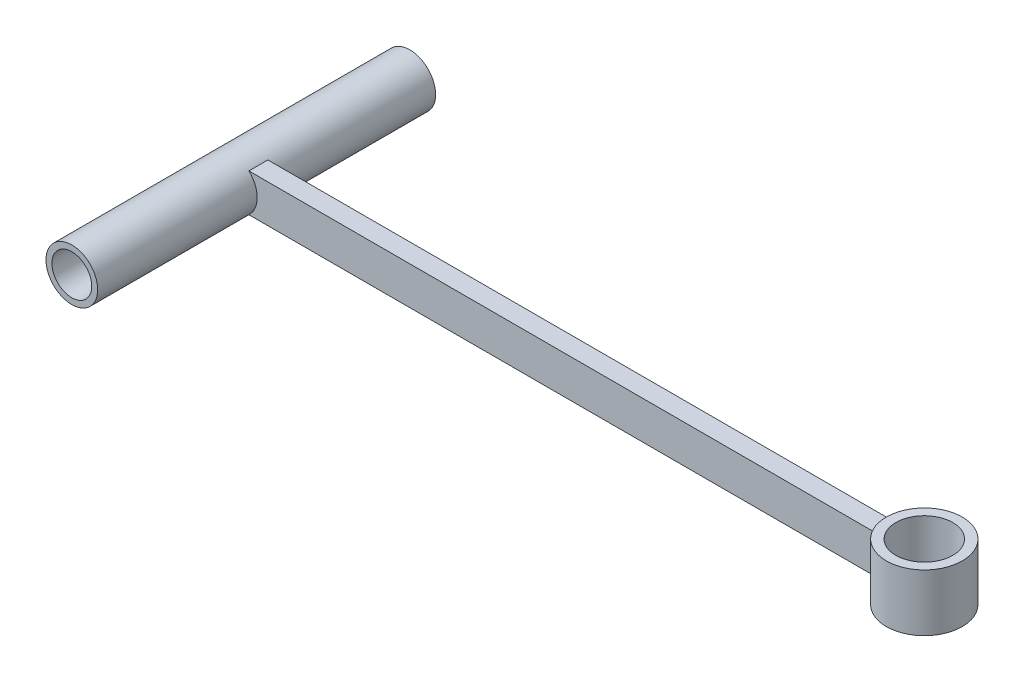
ISO-10303-21;
HEADER;
FILE_DESCRIPTION(('STEP AP214'),'2;1');
FILE_NAME('part.step','',(''),(''),'','','');
FILE_SCHEMA(('AUTOMOTIVE_DESIGN { 1 0 10303 214 1 1 1 1 }'));
ENDSEC;
DATA;
#1=APPLICATION_CONTEXT('core data for automotive mechanical design processes');
#2=APPLICATION_PROTOCOL_DEFINITION('international standard','automotive_design',2000,#1);
#3=PRODUCT_CONTEXT('',#1,'mechanical');
#4=PRODUCT('Part','Part','',(#3));
#5=PRODUCT_RELATED_PRODUCT_CATEGORY('part','',(#4));
#6=PRODUCT_DEFINITION_FORMATION('','',#4);
#7=PRODUCT_DEFINITION_CONTEXT('part definition',#1,'design');
#8=PRODUCT_DEFINITION('design','',#6,#7);
#9=PRODUCT_DEFINITION_SHAPE('','',#8);
#10=(LENGTH_UNIT() NAMED_UNIT(*) SI_UNIT(.MILLI.,.METRE.));
#11=(NAMED_UNIT(*) PLANE_ANGLE_UNIT() SI_UNIT($,.RADIAN.));
#12=(NAMED_UNIT(*) SI_UNIT($,.STERADIAN.) SOLID_ANGLE_UNIT());
#13=UNCERTAINTY_MEASURE_WITH_UNIT(LENGTH_MEASURE(1.E-05),#10,'distance_accuracy_value','');
#14=(GEOMETRIC_REPRESENTATION_CONTEXT(3) GLOBAL_UNCERTAINTY_ASSIGNED_CONTEXT((#13)) GLOBAL_UNIT_ASSIGNED_CONTEXT((#10,
#11,#12)) REPRESENTATION_CONTEXT('',''));
#15=CARTESIAN_POINT('',(0.,0.,0.));
#16=DIRECTION('',(0.,0.,1.));
#17=DIRECTION('',(1.,0.,0.));
#18=AXIS2_PLACEMENT_3D('',#15,#16,#17);
#19=CARTESIAN_POINT('',(838.2,0.,226.06));
#20=DIRECTION('',(0.,0.,-1.));
#21=DIRECTION('',(-1.,0.,0.));
#22=AXIS2_PLACEMENT_3D('',#19,#20,#21);
#23=CYLINDRICAL_SURFACE('',#22,34.6075);
#24=CARTESIAN_POINT('',(872.8075,0.,29.1668295114498));
#25=CARTESIAN_POINT('',(872.807494550467,-0.598420598268063,29.1668266298653));
#26=CARTESIAN_POINT('',(872.791941543223,-1.19696171019112,29.1446818124968));
#27=CARTESIAN_POINT('',(872.730089892571,-2.38926127641869,29.0561768739175));
#28=CARTESIAN_POINT('',(872.683782894832,-2.98301838677625,28.9898047383256));
#29=CARTESIAN_POINT('',(872.561496970783,-4.16146658213996,28.8130389915155));
#30=CARTESIAN_POINT('',(872.485488453671,-4.74614801943301,28.7026014768586));
#31=CARTESIAN_POINT('',(872.305672903808,-5.90116493602303,28.4382335708991));
#32=CARTESIAN_POINT('',(872.201867840133,-6.47150142837049,28.2843062603227));
#33=CARTESIAN_POINT('',(871.969263708797,-7.59228025348201,27.9341482292038));
#34=CARTESIAN_POINT('',(871.840522559259,-8.14276524624357,27.7380154228489));
#35=CARTESIAN_POINT('',(871.560997687191,-9.22135032778113,27.3043287842656));
#36=CARTESIAN_POINT('',(871.410213633047,-9.74945007963859,27.0667743288782));
#37=CARTESIAN_POINT('',(871.090230980815,-10.779735165957,26.5517554924866));
#38=CARTESIAN_POINT('',(870.921037950362,-11.2819282682969,26.2743031701249));
#39=CARTESIAN_POINT('',(870.568111025118,-12.2578022028142,25.6812094670858));
#40=CARTESIAN_POINT('',(870.384377184689,-12.7314831415748,25.3655682291781));
#41=CARTESIAN_POINT('',(870.008483834137,-13.6433152534637,24.7017643849697));
#42=CARTESIAN_POINT('',(869.816435296343,-14.0817919150813,24.3539852020464));
#43=CARTESIAN_POINT('',(869.426110784528,-14.9273553850502,23.6254108710064));
#44=CARTESIAN_POINT('',(869.227834909276,-15.3344426909016,23.2446162463653));
#45=CARTESIAN_POINT('',(868.828909778361,-16.1165041873924,22.4524472840911));
#46=CARTESIAN_POINT('',(868.628260183587,-16.4914737250456,22.0410685317257));
#47=CARTESIAN_POINT('',(868.228276022054,-17.20902263665,21.1903953053996));
#48=CARTESIAN_POINT('',(868.028941532383,-17.5516001272573,20.7510992107439));
#49=CARTESIAN_POINT('',(867.611260410121,-18.2438858228432,19.7928955127561));
#50=CARTESIAN_POINT('',(867.393510131708,-18.5894973485391,19.2707670321925));
#51=CARTESIAN_POINT('',(866.968102432127,-19.2412797255224,18.1985668085569));
#52=CARTESIAN_POINT('',(866.760445687404,-19.5474479356746,17.6484931977066));
#53=CARTESIAN_POINT('',(866.358746936341,-20.1218022862183,16.5237630913908));
#54=CARTESIAN_POINT('',(866.164711437353,-20.3899703340621,15.9490950544906));
#55=CARTESIAN_POINT('',(865.793390624843,-20.8897283112197,14.7788531981634));
#56=CARTESIAN_POINT('',(865.616106182133,-21.1213163393249,14.1832782940886));
#57=CARTESIAN_POINT('',(865.251393081803,-21.5871145562122,12.8684740670578));
#58=CARTESIAN_POINT('',(865.067630714625,-21.8146728185514,12.1458646369219));
#59=CARTESIAN_POINT('',(864.729882656992,-22.2241940007744,10.6810414487084));
#60=CARTESIAN_POINT('',(864.575899865099,-22.4061524827612,9.9388257902627));
#61=CARTESIAN_POINT('',(864.300031277563,-22.7269049798664,8.43889069644177));
#62=CARTESIAN_POINT('',(864.178161262764,-22.8656777787374,7.68116383493186));
#63=CARTESIAN_POINT('',(863.968325371127,-23.101890636903,6.15466816305584));
#64=CARTESIAN_POINT('',(863.880361170951,-23.1993286521928,5.38589880858146));
#65=CARTESIAN_POINT('',(863.72791415033,-23.3670662421459,3.71415736450674));
#66=CARTESIAN_POINT('',(863.669666127415,-23.4302741315439,2.80989340750962));
#67=CARTESIAN_POINT('',(863.601692945117,-23.5039463381772,0.997345940970043));
#68=CARTESIAN_POINT('',(863.591972854365,-23.5144051458943,0.089062021467911));
#69=CARTESIAN_POINT('',(863.621225084062,-23.482777112649,-1.72663576616317));
#70=CARTESIAN_POINT('',(863.660242679586,-23.4406414138295,-2.63404804047717));
#71=CARTESIAN_POINT('',(863.78643628804,-23.3028371835515,-4.44156611712043));
#72=CARTESIAN_POINT('',(863.873612405353,-23.2071685360623,-5.34167190360885));
#73=CARTESIAN_POINT('',(864.042857661193,-23.0181066377322,-6.71029619063672));
#74=CARTESIAN_POINT('',(864.108242661925,-22.9445800303652,-7.18375727399101));
#75=CARTESIAN_POINT('',(864.251854947998,-22.7813915979303,-8.12591313068618));
#76=CARTESIAN_POINT('',(864.330080972002,-22.6917313575391,-8.59460836736519));
#77=CARTESIAN_POINT('',(864.498974032243,-22.4957715207726,-9.52637826968218));
#78=CARTESIAN_POINT('',(864.589644431691,-22.3894674251396,-9.989451378936));
#79=CARTESIAN_POINT('',(864.782870481707,-22.1597064027665,-10.908759294738));
#80=CARTESIAN_POINT('',(864.885424667713,-22.0362515893142,-11.3649949361279));
#81=CARTESIAN_POINT('',(865.10164726762,-21.771760765207,-12.2689900786109));
#82=CARTESIAN_POINT('',(865.215300830829,-21.6307481787608,-12.7167599740442));
#83=CARTESIAN_POINT('',(865.453070665535,-21.3303979900118,-13.6032606799182));
#84=CARTESIAN_POINT('',(865.577186282226,-21.1710615343456,-14.041992053931));
#85=CARTESIAN_POINT('',(865.834954477349,-20.8334691054249,-14.909085173294));
#86=CARTESIAN_POINT('',(865.968603709983,-20.6552197589967,-15.3374504865902));
#87=CARTESIAN_POINT('',(866.244434097462,-20.2791305559353,-16.1826817215574));
#88=CARTESIAN_POINT('',(866.386615505445,-20.0812901179486,-16.5995473015114));
#89=CARTESIAN_POINT('',(866.744269197756,-19.5714044678869,-17.6059912231332));
#90=CARTESIAN_POINT('',(866.963830831488,-19.248146468535,-18.188505767604));
#91=CARTESIAN_POINT('',(867.41414832503,-18.5575430248719,-19.3220524767982));
#92=CARTESIAN_POINT('',(867.644901516677,-18.1902080584036,-19.8730920778583));
#93=CARTESIAN_POINT('',(868.11255292399,-17.4104777135671,-20.9392187602162));
#94=CARTESIAN_POINT('',(868.349448317397,-16.9981027601506,-21.454321965881));
#95=CARTESIAN_POINT('',(868.823797044739,-16.1278519157427,-22.4444005047469));
#96=CARTESIAN_POINT('',(869.061250394346,-15.669974731427,-22.919374696638));
#97=CARTESIAN_POINT('',(869.532264804236,-14.7057212656522,-23.8283537637242));
#98=CARTESIAN_POINT('',(869.765781932124,-14.1989993306153,-24.2620157615273));
#99=CARTESIAN_POINT('',(870.220291009078,-13.1419507796693,-25.0801199891542));
#100=CARTESIAN_POINT('',(870.441282688942,-12.5916232271772,-25.4645611613246));
#101=CARTESIAN_POINT('',(870.863862974124,-11.450803679618,-26.1804818193446));
#102=CARTESIAN_POINT('',(871.065458944971,-10.8603270777166,-26.5119814415819));
#103=CARTESIAN_POINT('',(871.442842802349,-9.64354243978275,-27.1191924482556));
#104=CARTESIAN_POINT('',(871.618634640443,-9.01723991047558,-27.3949123770675));
#105=CARTESIAN_POINT('',(871.917764430839,-7.81806516706499,-27.8561493580554));
#106=CARTESIAN_POINT('',(872.044952243982,-7.24885993333634,-28.0487378994614));
#107=CARTESIAN_POINT('',(872.272205789759,-6.0918997768521,-28.3889216311787));
#108=CARTESIAN_POINT('',(872.372273946047,-5.50414651695791,-28.5365208422837));
#109=CARTESIAN_POINT('',(872.542695165088,-4.31497934635966,-28.7859144928559));
#110=CARTESIAN_POINT('',(872.613057951254,-3.7135699737211,-28.8877239213368));
#111=CARTESIAN_POINT('',(872.722303570619,-2.50190722882671,-29.045117574396));
#112=CARTESIAN_POINT('',(872.761187677066,-1.89165421529419,-29.1007036686147));
#113=CARTESIAN_POINT('',(872.804762141754,-0.714062115919691,-29.1629463418707));
#114=CARTESIAN_POINT('',(872.811826663423,-0.146986451422279,-29.1730005462443));
#115=CARTESIAN_POINT('',(872.798086546258,0.986116069351557,-29.1534039359557));
#116=CARTESIAN_POINT('',(872.777283702183,1.55214299081985,-29.1237556782746));
#117=CARTESIAN_POINT('',(872.708274931267,2.67891046071363,-29.0248802454455));
#118=CARTESIAN_POINT('',(872.660075094512,3.23965215584195,-28.9556618663313));
#119=CARTESIAN_POINT('',(872.537336327086,4.35194890634755,-28.7779261306993));
#120=CARTESIAN_POINT('',(872.462797176578,4.90350388500886,-28.6694084461747));
#121=CARTESIAN_POINT('',(872.290009834061,5.98731967233977,-28.4149970839524));
#122=CARTESIAN_POINT('',(872.19204196699,6.51972884815872,-28.2695441519284));
#123=CARTESIAN_POINT('',(871.974060834312,7.56826377404827,-27.9413395359917));
#124=CARTESIAN_POINT('',(871.854047971121,8.08438982115595,-27.7585885329258));
#125=CARTESIAN_POINT('',(871.594519613455,9.09716452807508,-27.3566814440718));
#126=CARTESIAN_POINT('',(871.455004513904,9.59381358203764,-27.1375260954601));
#127=CARTESIAN_POINT('',(871.159378828837,10.5648486638634,-26.6639560534431));
#128=CARTESIAN_POINT('',(871.003267818534,11.0392341214199,-26.4095404574669));
#129=CARTESIAN_POINT('',(870.671904522605,11.9796363646339,-25.8573183090826));
#130=CARTESIAN_POINT('',(870.496172196191,12.4447723480041,-25.5583005770722));
#131=CARTESIAN_POINT('',(870.134050278147,13.3465972532119,-24.9258586324428));
#132=CARTESIAN_POINT('',(869.947660510978,13.783285706237,-24.5924338530331));
#133=CARTESIAN_POINT('',(869.567958323939,14.6268336899952,-23.8932267071143));
#134=CARTESIAN_POINT('',(869.374644590215,15.0336875143634,-23.5274381798734));
#135=CARTESIAN_POINT('',(868.984825559709,15.8166007136052,-22.7658719247284));
#136=CARTESIAN_POINT('',(868.788320127023,16.1926587730366,-22.3700929171686));
#137=CARTESIAN_POINT('',(868.376771394509,16.9482742138144,-21.5116280064444));
#138=CARTESIAN_POINT('',(868.161760815656,17.3246969041752,-21.0461671868288));
#139=CARTESIAN_POINT('',(867.736418811331,18.0402977388628,-20.0854723548854));
#140=CARTESIAN_POINT('',(867.526087649117,18.3794737919442,-19.590236673235));
#141=CARTESIAN_POINT('',(867.113841967886,19.021419556439,-18.5731115222991));
#142=CARTESIAN_POINT('',(866.911930811259,19.3241748130674,-18.051211586741));
#143=CARTESIAN_POINT('',(866.519926751221,19.8942321914816,-16.9841620808435));
#144=CARTESIAN_POINT('',(866.329834448006,20.1615325135448,-16.4390113321281));
#145=CARTESIAN_POINT('',(865.934666894594,20.7025871004459,-15.238526584194));
#146=CARTESIAN_POINT('',(865.732155034531,20.9703687013151,-14.5796524656097));
#147=CARTESIAN_POINT('',(865.350540475531,21.462154635953,-13.2391973175045));
#148=CARTESIAN_POINT('',(865.171439903924,21.6861549923372,-12.5576142315248));
#149=CARTESIAN_POINT('',(864.839426528618,22.0927351875912,-11.1756343680051));
#150=CARTESIAN_POINT('',(864.68652604959,22.2752955458945,-10.4752289145509));
#151=CARTESIAN_POINT('',(864.409194271038,22.6009485581556,-9.05978103262078));
#152=CARTESIAN_POINT('',(864.284764430712,22.7440391892579,-8.34473785596644));
#153=CARTESIAN_POINT('',(864.046519331258,23.0146641767911,-6.77524247135989));
#154=CARTESIAN_POINT('',(863.938537496734,23.1348939023788,-5.91863422693986));
#155=CARTESIAN_POINT('',(863.766139660145,23.3252645864921,-4.19549941369655));
#156=CARTESIAN_POINT('',(863.701728258713,23.3954002555945,-3.32897180730145));
#157=CARTESIAN_POINT('',(863.61743989557,23.4869475900943,-1.59045583545604));
#158=CARTESIAN_POINT('',(863.597600492597,23.5083181636659,-0.718463485032506));
#159=CARTESIAN_POINT('',(863.602862612187,23.5026292140032,1.02522509165733));
#160=CARTESIAN_POINT('',(863.62796513944,23.4755686080771,1.89692131086783));
#161=CARTESIAN_POINT('',(863.727616909599,23.3672001093092,3.72428753121791));
#162=CARTESIAN_POINT('',(863.806977541634,23.2806086621849,4.67939195166019));
#163=CARTESIAN_POINT('',(864.01842266554,23.0458895709613,6.57628202593088));
#164=CARTESIAN_POINT('',(864.150514645046,22.8977531876133,7.51806576860499));
#165=CARTESIAN_POINT('',(864.464600350857,22.5367930406342,9.38012399049858));
#166=CARTESIAN_POINT('',(864.646562743944,22.3240098850194,10.3004115828984));
#167=CARTESIAN_POINT('',(865.05623150239,21.8294537450969,12.1117237955234));
#168=CARTESIAN_POINT('',(865.283924765786,21.5477005157697,13.0027567123792));
#169=CARTESIAN_POINT('',(865.725372824511,20.9793342968045,14.5576617434451));
#170=CARTESIAN_POINT('',(865.931473073736,20.7069794467729,15.228949961931));
#171=CARTESIAN_POINT('',(866.364196774002,20.1144648841732,16.5432747307368));
#172=CARTESIAN_POINT('',(866.590818403026,19.7943094140084,17.1863137816801));
#173=CARTESIAN_POINT('',(867.059558340224,19.1044127780983,18.4382450867033));
#174=CARTESIAN_POINT('',(867.301657527993,18.7347321978794,19.0471777933542));
#175=CARTESIAN_POINT('',(867.795872337658,17.9438202925871,20.2263131487665));
#176=CARTESIAN_POINT('',(868.047986589512,17.5225960023028,20.7965210662831));
#177=CARTESIAN_POINT('',(868.517120806083,16.6955594076196,21.8097323976507));
#178=CARTESIAN_POINT('',(868.733678463002,16.2970598513478,22.258928002105));
#179=CARTESIAN_POINT('',(869.164637859831,15.4625578175785,23.1221683340408));
#180=CARTESIAN_POINT('',(869.379039798445,15.0265588326528,23.5362163279321));
#181=CARTESIAN_POINT('',(869.800874524605,14.1178845927116,24.3260887073628));
#182=CARTESIAN_POINT('',(870.008306157836,13.6452033054034,24.7019067825277));
#183=CARTESIAN_POINT('',(870.411147842088,12.6649797910782,25.4123535509278));
#184=CARTESIAN_POINT('',(870.606557885936,12.1574375432608,25.7469822195861));
#185=CARTESIAN_POINT('',(870.981400300342,11.1072640651146,26.3742204492256));
#186=CARTESIAN_POINT('',(871.16073988131,10.5644568267614,26.666591301049));
#187=CARTESIAN_POINT('',(871.497458303918,9.44972310239261,27.2050151363416));
#188=CARTESIAN_POINT('',(871.654835281797,8.87779415070501,27.4510641895329));
#189=CARTESIAN_POINT('',(871.943110091407,7.70992308536136,27.8948470172789));
#190=CARTESIAN_POINT('',(872.074041157251,7.114012253645,28.0926414983347));
#191=CARTESIAN_POINT('',(872.306000537869,5.90252170777746,28.4390366992363));
#192=CARTESIAN_POINT('',(872.407039417535,5.28694902820668,28.5876548018521));
#193=CARTESIAN_POINT('',(872.543623354784,4.28288406948846,28.7870106921634));
#194=CARTESIAN_POINT('',(872.589378208248,3.8987802301034,28.8533646199036));
#195=CARTESIAN_POINT('',(872.668175158833,3.12642932438667,28.967216582601));
#196=CARTESIAN_POINT('',(872.701216159183,2.73818190357352,29.0147129908109));
#197=CARTESIAN_POINT('',(872.754219892193,1.95894240331633,29.0907399393041));
#198=CARTESIAN_POINT('',(872.774182469529,1.56795029133117,29.11927025434));
#199=CARTESIAN_POINT('',(872.800823629495,0.784655962634776,29.1573150110423));
#200=CARTESIAN_POINT('',(872.807503572981,0.392353884260238,29.166831400758));
#201=CARTESIAN_POINT('',(872.8075,0.,29.1668295114498));
#202=B_SPLINE_CURVE_WITH_KNOTS('',3,(#24,#25,#26,#27,#28,#29,#30,#31,#32,#33,#34,#35,#36,#37,
#38,#39,#40,#41,#42,#43,#44,#45,#46,#47,#48,#49,#50,#51,#52,#53,#54,#55,#56,#57,#58,#59,#60,#61,
#62,#63,#64,#65,#66,#67,#68,#69,#70,#71,#72,#73,#74,#75,#76,#77,#78,#79,#80,#81,#82,#83,#84,#85,
#86,#87,#88,#89,#90,#91,#92,#93,#94,#95,#96,#97,#98,#99,#100,#101,#102,#103,#104,#105,#106,#107,
#108,#109,#110,#111,#112,#113,#114,#115,#116,#117,#118,#119,#120,#121,#122,#123,#124,#125,#126,
#127,#128,#129,#130,#131,#132,#133,#134,#135,#136,#137,#138,#139,#140,#141,#142,#143,#144,#145,
#146,#147,#148,#149,#150,#151,#152,#153,#154,#155,#156,#157,#158,#159,#160,#161,#162,#163,#164,
#165,#166,#167,#168,#169,#170,#171,#172,#173,#174,#175,#176,#177,#178,#179,#180,#181,#182,#183,
#184,#185,#186,#187,#188,#189,#190,#191,#192,#193,#194,#195,#196,#197,#198,#199,#200,#201),
.UNSPECIFIED.,.T.,.F.,(4,2,2,2,2,2,2,2,2,2,2,2,2,2,2,2,2,2,2,2,2,2,2,2,2,2,2,2,2,2,2,2,2,2,2,2,
2,2,2,2,2,2,2,2,2,2,2,2,2,2,2,2,2,2,2,2,2,2,2,2,2,2,2,2,2,2,2,2,2,2,2,2,2,2,2,2,2,2,2,2,2,2,2,2,
2,2,2,2,4),(0.,1.79486126268971,3.59021029953555,5.38735257198183,7.18436757053434,
8.97725770425198,10.7701748130472,12.5625511690734,14.3549208244808,16.1281437555606,
17.9013385764769,19.6747898518642,21.4483441762325,23.4351791482455,25.4221470901966,
27.4100579066705,29.3980720087707,31.7344551673274,34.0710656209366,36.4088221980927,
38.7466943638288,41.4687796930976,44.1911493319203,46.9160498090334,49.6409561922984,
51.091299770884,52.5415009716068,53.9920948776458,55.4425102017777,56.8910108221004,
58.3394208501323,59.787325040008,61.2352722084242,63.3374265407718,65.4390821416902,
67.5397886000041,69.6405547844472,71.7574643379793,73.8744193718709,75.9905672915731,
78.1063908122859,79.946608701801,81.786662078807,83.6261126860848,85.4654888876891,
87.1650703413274,88.864542341076,90.563636712373,92.2627452652753,93.9424602584149,
95.6221445924309,97.3017949175309,98.9814882452767,100.720244112268,102.459028626536,
104.198144849237,105.937335319642,107.843611429902,109.749994515059,111.657131731853,
113.564365719526,115.780647107145,117.997129743272,120.214652179821,122.432288245079,
125.044727903947,127.657443369131,130.272359622892,132.887334334529,135.770747397462,
138.654570038869,141.536584932793,144.417775300034,146.67519718072,148.932418829533,
151.186903947052,153.44108171039,155.35416122619,157.267062756684,159.180279527303,
161.093497439488,163.017132573383,164.940930848975,166.862296269718,168.782981802637,
169.959785960767,171.136691614077,172.313611244452,173.49041028874),.UNSPECIFIED.);
#203=CARTESIAN_POINT('',(865.213111503166,-21.6326342170234,12.7000000000001));
#204=VERTEX_POINT('',#203);
#205=CARTESIAN_POINT('',(865.213111503166,-21.6326342170232,-12.7));
#206=VERTEX_POINT('',#205);
#207=EDGE_CURVE('E63',#204,#206,#202,.T.);
#208=ORIENTED_EDGE('',*,*,#207,.F.);
#209=CARTESIAN_POINT('',(838.2,0.,12.7));
#210=DIRECTION('',(0.,0.,-1.));
#211=DIRECTION('',(0.,1.,0.));
#212=AXIS2_PLACEMENT_3D('',#209,#210,#211);
#213=CIRCLE('',#212,34.6075);
#214=CARTESIAN_POINT('',(861.705723903977,-25.4,12.7));
#215=VERTEX_POINT('',#214);
#216=EDGE_CURVE('E204',#204,#215,#213,.T.);
#217=ORIENTED_EDGE('',*,*,#216,.T.);
#218=DIRECTION('',(0.,0.,-1.));
#219=VECTOR('',#218,1.);
#220=CARTESIAN_POINT('',(861.705723903977,-25.4,226.06));
#221=LINE('',#220,#219);
#222=CARTESIAN_POINT('',(861.705723903977,-25.4,-12.6999999999999));
#223=VERTEX_POINT('',#222);
#224=EDGE_CURVE('E149',#215,#223,#221,.T.);
#225=ORIENTED_EDGE('',*,*,#224,.T.);
#226=CARTESIAN_POINT('',(838.2,0.,-12.7));
#227=DIRECTION('',(0.,0.,1.));
#228=DIRECTION('',(0.,-1.,0.));
#229=AXIS2_PLACEMENT_3D('',#226,#227,#228);
#230=CIRCLE('',#229,34.6075);
#231=EDGE_CURVE('E166',#223,#206,#230,.T.);
#232=ORIENTED_EDGE('',*,*,#231,.T.);
#233=EDGE_LOOP('',(#208,#217,#225,#232));
#234=FACE_BOUND('',#233,.T.);
#235=ADVANCED_FACE('F46',(#234),#23,.T.);
#236=CARTESIAN_POINT('',(865.213111503166,21.6326342170232,-12.7));
#237=VERTEX_POINT('',#236);
#238=CARTESIAN_POINT('',(865.213111503166,21.6326342170232,12.7));
#239=VERTEX_POINT('',#238);
#240=EDGE_CURVE('E260',#237,#239,#202,.T.);
#241=ORIENTED_EDGE('',*,*,#240,.F.);
#242=CARTESIAN_POINT('',(861.705723903977,25.4,-12.6999999999999));
#243=VERTEX_POINT('',#242);
#244=EDGE_CURVE('E200',#237,#243,#230,.T.);
#245=ORIENTED_EDGE('',*,*,#244,.T.);
#246=DIRECTION('',(0.,0.,-1.));
#247=VECTOR('',#246,1.);
#248=CARTESIAN_POINT('',(861.705723903977,25.4,226.06));
#249=LINE('',#248,#247);
#250=CARTESIAN_POINT('',(861.705723903977,25.4,12.7000000000001));
#251=VERTEX_POINT('',#250);
#252=EDGE_CURVE('E170',#251,#243,#249,.T.);
#253=ORIENTED_EDGE('',*,*,#252,.F.);
#254=EDGE_CURVE('E196',#251,#239,#213,.T.);
#255=ORIENTED_EDGE('',*,*,#254,.T.);
#256=EDGE_LOOP('',(#241,#245,#253,#255));
#257=FACE_BOUND('',#256,.T.);
#258=ADVANCED_FACE('F249',(#257),#23,.T.);
#259=CARTESIAN_POINT('',(23.5057239039771,-25.4,12.7));
#260=DIRECTION('',(0.,0.,1.));
#261=DIRECTION('',(0.,-1.,0.));
#262=AXIS2_PLACEMENT_3D('',#259,#260,#261);
#263=PLANE('',#262);
#264=ORIENTED_EDGE('',*,*,#216,.F.);
#265=DIRECTION('',(0.,-1.,0.));
#266=VECTOR('',#265,1.);
#267=CARTESIAN_POINT('',(865.213111503166,38.1,12.7000000000001));
#268=LINE('',#267,#266);
#269=EDGE_CURVE('E270',#204,#239,#268,.F.);
#270=ORIENTED_EDGE('',*,*,#269,.T.);
#271=ORIENTED_EDGE('',*,*,#254,.F.);
#272=DIRECTION('',(1.,0.,0.));
#273=VECTOR('',#272,1.);
#274=CARTESIAN_POINT('',(23.5057239039771,25.4,12.7000000000001));
#275=LINE('',#274,#273);
#276=CARTESIAN_POINT('',(23.5057239039771,25.4,12.7000000000001));
#277=VERTEX_POINT('',#276);
#278=EDGE_CURVE('E176',#277,#251,#275,.T.);
#279=ORIENTED_EDGE('',*,*,#278,.F.);
#280=CARTESIAN_POINT('',(0.,0.,12.7));
#281=DIRECTION('',(0.,0.,-1.));
#282=DIRECTION('',(0.,1.,0.));
#283=AXIS2_PLACEMENT_3D('',#280,#281,#282);
#284=CIRCLE('',#283,34.6075);
#285=CARTESIAN_POINT('',(23.5057239039771,-25.4,12.7));
#286=VERTEX_POINT('',#285);
#287=EDGE_CURVE('E171',#277,#286,#284,.T.);
#288=ORIENTED_EDGE('',*,*,#287,.T.);
#289=DIRECTION('',(1.,0.,0.));
#290=VECTOR('',#289,1.);
#291=CARTESIAN_POINT('',(23.5057239039771,-25.4,12.7));
#292=LINE('',#291,#290);
#293=EDGE_CURVE('E186',#286,#215,#292,.T.);
#294=ORIENTED_EDGE('',*,*,#293,.T.);
#295=EDGE_LOOP('',(#264,#270,#271,#279,#288,#294));
#296=FACE_BOUND('',#295,.T.);
#297=ADVANCED_FACE('F254',(#296),#263,.T.);
#298=CARTESIAN_POINT('',(23.5057239039771,25.4,-12.7));
#299=DIRECTION('',(0.,0.,-1.));
#300=DIRECTION('',(0.,1.,0.));
#301=AXIS2_PLACEMENT_3D('',#298,#299,#300);
#302=PLANE('',#301);
#303=ORIENTED_EDGE('',*,*,#244,.F.);
#304=DIRECTION('',(0.,-1.,0.));
#305=VECTOR('',#304,1.);
#306=CARTESIAN_POINT('',(865.213111503166,38.1,-12.7));
#307=LINE('',#306,#305);
#308=EDGE_CURVE('E268',#237,#206,#307,.T.);
#309=ORIENTED_EDGE('',*,*,#308,.T.);
#310=ORIENTED_EDGE('',*,*,#231,.F.);
#311=DIRECTION('',(1.,0.,0.));
#312=VECTOR('',#311,1.);
#313=CARTESIAN_POINT('',(23.5057239039771,-25.4,-12.7));
#314=LINE('',#313,#312);
#315=CARTESIAN_POINT('',(23.5057239039771,-25.4,-12.7));
#316=VERTEX_POINT('',#315);
#317=EDGE_CURVE('E201',#316,#223,#314,.T.);
#318=ORIENTED_EDGE('',*,*,#317,.F.);
#319=CARTESIAN_POINT('',(0.,0.,-12.7));
#320=DIRECTION('',(0.,0.,1.));
#321=DIRECTION('',(0.,-1.,0.));
#322=AXIS2_PLACEMENT_3D('',#319,#320,#321);
#323=CIRCLE('',#322,34.6075);
#324=CARTESIAN_POINT('',(23.5057239039771,25.4,-12.7));
#325=VERTEX_POINT('',#324);
#326=EDGE_CURVE('E161',#316,#325,#323,.T.);
#327=ORIENTED_EDGE('',*,*,#326,.T.);
#328=DIRECTION('',(1.,0.,0.));
#329=VECTOR('',#328,1.);
#330=CARTESIAN_POINT('',(23.5057239039771,25.4,-12.7));
#331=LINE('',#330,#329);
#332=EDGE_CURVE('E169',#325,#243,#331,.T.);
#333=ORIENTED_EDGE('',*,*,#332,.T.);
#334=EDGE_LOOP('',(#303,#309,#310,#318,#327,#333));
#335=FACE_BOUND('',#334,.T.);
#336=ADVANCED_FACE('F258',(#335),#302,.T.);
#337=CARTESIAN_POINT('',(0.,0.,226.06));
#338=DIRECTION('',(0.,0.,1.));
#339=DIRECTION('',(1.,0.,0.));
#340=AXIS2_PLACEMENT_3D('',#337,#338,#339);
#341=PLANE('',#340);
#342=CARTESIAN_POINT('',(0.,0.,226.06));
#343=DIRECTION('',(0.,0.,1.));
#344=DIRECTION('',(1.,0.,0.));
#345=AXIS2_PLACEMENT_3D('',#342,#343,#344);
#346=CIRCLE('',#345,34.6075);
#347=CARTESIAN_POINT('',(34.6075,0.,226.06));
#348=VERTEX_POINT('',#347);
#349=EDGE_CURVE('E56',#348,#348,#346,.T.);
#350=ORIENTED_EDGE('',*,*,#349,.T.);
#351=EDGE_LOOP('',(#350));
#352=FACE_BOUND('',#351,.T.);
#353=CARTESIAN_POINT('',(0.,0.,226.06));
#354=DIRECTION('',(0.,0.,1.));
#355=DIRECTION('',(1.,0.,0.));
#356=AXIS2_PLACEMENT_3D('',#353,#354,#355);
#357=CIRCLE('',#356,26.67);
#358=CARTESIAN_POINT('',(-26.67,0.,226.06));
#359=VERTEX_POINT('',#358);
#360=EDGE_CURVE('E205',#359,#359,#357,.T.);
#361=ORIENTED_EDGE('',*,*,#360,.F.);
#362=EDGE_LOOP('',(#361));
#363=FACE_BOUND('',#362,.T.);
#364=ADVANCED_FACE('F225',(#352,#363),#341,.T.);
#365=CARTESIAN_POINT('',(0.,0.,-226.06));
#366=DIRECTION('',(0.,0.,1.));
#367=DIRECTION('',(1.,0.,0.));
#368=AXIS2_PLACEMENT_3D('',#365,#366,#367);
#369=PLANE('',#368);
#370=CARTESIAN_POINT('',(0.,0.,-226.06));
#371=DIRECTION('',(0.,0.,1.));
#372=DIRECTION('',(1.,0.,0.));
#373=AXIS2_PLACEMENT_3D('',#370,#371,#372);
#374=CIRCLE('',#373,34.6075);
#375=CARTESIAN_POINT('',(34.6075,0.,-226.06));
#376=VERTEX_POINT('',#375);
#377=EDGE_CURVE('E210',#376,#376,#374,.T.);
#378=ORIENTED_EDGE('',*,*,#377,.F.);
#379=EDGE_LOOP('',(#378));
#380=FACE_BOUND('',#379,.T.);
#381=CARTESIAN_POINT('',(0.,0.,-226.06));
#382=DIRECTION('',(0.,0.,1.));
#383=DIRECTION('',(1.,0.,0.));
#384=AXIS2_PLACEMENT_3D('',#381,#382,#383);
#385=CIRCLE('',#384,26.67);
#386=CARTESIAN_POINT('',(-26.67,0.,-226.06));
#387=VERTEX_POINT('',#386);
#388=EDGE_CURVE('E165',#387,#387,#385,.T.);
#389=ORIENTED_EDGE('',*,*,#388,.T.);
#390=EDGE_LOOP('',(#389));
#391=FACE_BOUND('',#390,.T.);
#392=ADVANCED_FACE('F222',(#380,#391),#369,.F.);
#393=CARTESIAN_POINT('',(0.,0.,226.06));
#394=DIRECTION('',(0.,0.,-1.));
#395=DIRECTION('',(-1.,0.,0.));
#396=AXIS2_PLACEMENT_3D('',#393,#394,#395);
#397=CYLINDRICAL_SURFACE('',#396,34.6075);
#398=ORIENTED_EDGE('',*,*,#326,.F.);
#399=DIRECTION('',(0.,0.,-1.));
#400=VECTOR('',#399,1.);
#401=CARTESIAN_POINT('',(23.5057239039771,-25.4,226.06));
#402=LINE('',#401,#400);
#403=EDGE_CURVE('E177',#286,#316,#402,.T.);
#404=ORIENTED_EDGE('',*,*,#403,.F.);
#405=ORIENTED_EDGE('',*,*,#287,.F.);
#406=DIRECTION('',(0.,0.,-1.));
#407=VECTOR('',#406,1.);
#408=CARTESIAN_POINT('',(23.5057239039771,25.4,226.06));
#409=LINE('',#408,#407);
#410=EDGE_CURVE('E167',#277,#325,#409,.T.);
#411=ORIENTED_EDGE('',*,*,#410,.T.);
#412=EDGE_LOOP('',(#398,#404,#405,#411));
#413=FACE_BOUND('',#412,.T.);
#414=ORIENTED_EDGE('',*,*,#349,.F.);
#415=EDGE_LOOP('',(#414));
#416=FACE_BOUND('',#415,.T.);
#417=ORIENTED_EDGE('',*,*,#377,.T.);
#418=EDGE_LOOP('',(#417));
#419=FACE_BOUND('',#418,.T.);
#420=ADVANCED_FACE('F48',(#413,#416,#419),#397,.T.);
#421=CARTESIAN_POINT('',(0.,0.,226.06));
#422=DIRECTION('',(0.,0.,-1.));
#423=DIRECTION('',(-1.,0.,0.));
#424=AXIS2_PLACEMENT_3D('',#421,#422,#423);
#425=CYLINDRICAL_SURFACE('',#424,26.67);
#426=CARTESIAN_POINT('',(-26.67,0.,226.06));
#427=CARTESIAN_POINT('',(-26.67,0.,221.350416666667));
#428=CARTESIAN_POINT('',(-26.67,0.,216.640833333333));
#429=CARTESIAN_POINT('',(-26.67,0.,207.221666666667));
#430=CARTESIAN_POINT('',(-26.67,0.,202.512083333333));
#431=CARTESIAN_POINT('',(-26.67,0.,193.092916666667));
#432=CARTESIAN_POINT('',(-26.67,0.,188.383333333333));
#433=CARTESIAN_POINT('',(-26.67,0.,178.964166666667));
#434=CARTESIAN_POINT('',(-26.67,0.,174.254583333333));
#435=CARTESIAN_POINT('',(-26.67,0.,164.835416666667));
#436=CARTESIAN_POINT('',(-26.67,0.,160.125833333333));
#437=CARTESIAN_POINT('',(-26.67,0.,150.706666666667));
#438=CARTESIAN_POINT('',(-26.67,0.,145.997083333333));
#439=CARTESIAN_POINT('',(-26.67,0.,136.577916666667));
#440=CARTESIAN_POINT('',(-26.67,0.,131.868333333333));
#441=CARTESIAN_POINT('',(-26.67,0.,122.449166666667));
#442=CARTESIAN_POINT('',(-26.67,0.,117.739583333333));
#443=CARTESIAN_POINT('',(-26.67,0.,108.320416666667));
#444=CARTESIAN_POINT('',(-26.67,0.,103.610833333333));
#445=CARTESIAN_POINT('',(-26.67,0.,94.1916666666667));
#446=CARTESIAN_POINT('',(-26.67,0.,89.4820833333333));
#447=CARTESIAN_POINT('',(-26.67,0.,80.0629166666667));
#448=CARTESIAN_POINT('',(-26.67,0.,75.3533333333333));
#449=CARTESIAN_POINT('',(-26.67,0.,65.9341666666666));
#450=CARTESIAN_POINT('',(-26.67,0.,61.2245833333333));
#451=CARTESIAN_POINT('',(-26.67,0.,51.8054166666667));
#452=CARTESIAN_POINT('',(-26.67,0.,47.0958333333333));
#453=CARTESIAN_POINT('',(-26.67,0.,37.6766666666666));
#454=CARTESIAN_POINT('',(-26.67,0.,32.9670833333333));
#455=CARTESIAN_POINT('',(-26.67,0.,23.5479166666666));
#456=CARTESIAN_POINT('',(-26.67,0.,18.8383333333333));
#457=CARTESIAN_POINT('',(-26.67,0.,9.41916666666664));
#458=CARTESIAN_POINT('',(-26.67,0.,4.70958333333331));
#459=CARTESIAN_POINT('',(-26.67,0.,-4.70958333333336));
#460=CARTESIAN_POINT('',(-26.67,0.,-9.41916666666669));
#461=CARTESIAN_POINT('',(-26.67,0.,-18.8383333333333));
#462=CARTESIAN_POINT('',(-26.67,0.,-23.5479166666667));
#463=CARTESIAN_POINT('',(-26.67,0.,-32.9670833333333));
#464=CARTESIAN_POINT('',(-26.67,0.,-37.6766666666666));
#465=CARTESIAN_POINT('',(-26.67,0.,-47.0958333333333));
#466=CARTESIAN_POINT('',(-26.67,0.,-51.8054166666666));
#467=CARTESIAN_POINT('',(-26.67,0.,-61.2245833333333));
#468=CARTESIAN_POINT('',(-26.67,0.,-65.9341666666666));
#469=CARTESIAN_POINT('',(-26.67,0.,-75.3533333333333));
#470=CARTESIAN_POINT('',(-26.67,0.,-80.0629166666667));
#471=CARTESIAN_POINT('',(-26.67,0.,-89.4820833333333));
#472=CARTESIAN_POINT('',(-26.67,0.,-94.1916666666666));
#473=CARTESIAN_POINT('',(-26.67,0.,-103.610833333333));
#474=CARTESIAN_POINT('',(-26.67,0.,-108.320416666667));
#475=CARTESIAN_POINT('',(-26.67,0.,-117.739583333333));
#476=CARTESIAN_POINT('',(-26.67,0.,-122.449166666667));
#477=CARTESIAN_POINT('',(-26.67,0.,-131.868333333333));
#478=CARTESIAN_POINT('',(-26.67,0.,-136.577916666667));
#479=CARTESIAN_POINT('',(-26.67,0.,-145.997083333333));
#480=CARTESIAN_POINT('',(-26.67,0.,-150.706666666667));
#481=CARTESIAN_POINT('',(-26.67,0.,-160.125833333333));
#482=CARTESIAN_POINT('',(-26.67,0.,-164.835416666667));
#483=CARTESIAN_POINT('',(-26.67,0.,-174.254583333333));
#484=CARTESIAN_POINT('',(-26.67,0.,-178.964166666667));
#485=CARTESIAN_POINT('',(-26.67,0.,-188.383333333333));
#486=CARTESIAN_POINT('',(-26.67,0.,-193.092916666667));
#487=CARTESIAN_POINT('',(-26.67,0.,-202.512083333333));
#488=CARTESIAN_POINT('',(-26.67,0.,-207.221666666667));
#489=CARTESIAN_POINT('',(-26.67,0.,-216.640833333333));
#490=CARTESIAN_POINT('',(-26.67,0.,-221.350416666667));
#491=CARTESIAN_POINT('',(-26.67,0.,-226.06));
#492=B_SPLINE_CURVE_WITH_KNOTS('',3,(#426,#427,#428,#429,#430,#431,#432,#433,#434,#435,#436,
#437,#438,#439,#440,#441,#442,#443,#444,#445,#446,#447,#448,#449,#450,#451,#452,#453,#454,#455,
#456,#457,#458,#459,#460,#461,#462,#463,#464,#465,#466,#467,#468,#469,#470,#471,#472,#473,#474,
#475,#476,#477,#478,#479,#480,#481,#482,#483,#484,#485,#486,#487,#488,#489,#490,#491),
.UNSPECIFIED.,.F.,.F.,(4,2,2,2,2,2,2,2,2,2,2,2,2,2,2,2,2,2,2,2,2,2,2,2,2,2,2,2,2,2,2,2,4),(0.,
14.12875,28.2575,42.38625,56.515,70.64375,84.7725,98.90125,113.03,127.15875,141.2875,155.41625,
169.545,183.67375,197.8025,211.93125,226.06,240.18875,254.3175,268.44625,282.575,296.70375,
310.8325,324.96125,339.09,353.21875,367.3475,381.47625,395.605,409.73375,423.8625,437.99125,
452.12),.UNSPECIFIED.);
#493=EDGE_CURVE('BSEAM228',#359,#387,#492,.T.);
#494=ORIENTED_EDGE('',*,*,#360,.T.);
#495=ORIENTED_EDGE('',*,*,#388,.F.);
#496=ORIENTED_EDGE('',*,*,#493,.T.);
#497=ORIENTED_EDGE('',*,*,#493,.F.);
#498=EDGE_LOOP('',(#494,#496,#495,#497));
#499=FACE_BOUND('',#498,.T.);
#500=ADVANCED_FACE('F228',(#499),#425,.F.);
#501=CARTESIAN_POINT('',(23.5057239039771,-25.4,226.06));
#502=DIRECTION('',(0.,-1.,0.));
#503=DIRECTION('',(0.,0.,-1.));
#504=AXIS2_PLACEMENT_3D('',#501,#502,#503);
#505=PLANE('',#504);
#506=ORIENTED_EDGE('',*,*,#224,.F.);
#507=ORIENTED_EDGE('',*,*,#293,.F.);
#508=ORIENTED_EDGE('',*,*,#403,.T.);
#509=ORIENTED_EDGE('',*,*,#317,.T.);
#510=EDGE_LOOP('',(#506,#507,#508,#509));
#511=FACE_BOUND('',#510,.T.);
#512=ADVANCED_FACE('F230',(#511),#505,.T.);
#513=CARTESIAN_POINT('',(23.5057239039771,25.4,226.06));
#514=DIRECTION('',(0.,-1.,0.));
#515=DIRECTION('',(0.,0.,-1.));
#516=AXIS2_PLACEMENT_3D('',#513,#514,#515);
#517=PLANE('',#516);
#518=ORIENTED_EDGE('',*,*,#252,.T.);
#519=ORIENTED_EDGE('',*,*,#332,.F.);
#520=ORIENTED_EDGE('',*,*,#410,.F.);
#521=ORIENTED_EDGE('',*,*,#278,.T.);
#522=EDGE_LOOP('',(#518,#519,#520,#521));
#523=FACE_BOUND('',#522,.T.);
#524=ADVANCED_FACE('F233',(#523),#517,.F.);
#525=CARTESIAN_POINT('',(914.4,38.1,0.));
#526=DIRECTION('',(0.,1.,0.));
#527=DIRECTION('',(0.,0.,1.));
#528=AXIS2_PLACEMENT_3D('',#525,#526,#527);
#529=PLANE('',#528);
#530=CARTESIAN_POINT('',(914.4,38.1,0.));
#531=DIRECTION('',(0.,1.,0.));
#532=DIRECTION('',(0.,0.,1.));
#533=AXIS2_PLACEMENT_3D('',#530,#531,#532);
#534=CIRCLE('',#533,50.8);
#535=CARTESIAN_POINT('',(914.4,38.1,50.8));
#536=VERTEX_POINT('',#535);
#537=EDGE_CURVE('E138',#536,#536,#534,.T.);
#538=ORIENTED_EDGE('',*,*,#537,.T.);
#539=EDGE_LOOP('',(#538));
#540=FACE_BOUND('',#539,.T.);
#541=CARTESIAN_POINT('',(914.4,38.1,0.));
#542=DIRECTION('',(0.,1.,0.));
#543=DIRECTION('',(0.,0.,1.));
#544=AXIS2_PLACEMENT_3D('',#541,#542,#543);
#545=CIRCLE('',#544,38.1);
#546=CARTESIAN_POINT('',(914.4,38.1,-38.1));
#547=VERTEX_POINT('',#546);
#548=EDGE_CURVE('E498',#547,#547,#545,.T.);
#549=ORIENTED_EDGE('',*,*,#548,.F.);
#550=EDGE_LOOP('',(#549));
#551=FACE_BOUND('',#550,.T.);
#552=ADVANCED_FACE('F240',(#540,#551),#529,.T.);
#553=CARTESIAN_POINT('',(914.4,-38.1,0.));
#554=DIRECTION('',(0.,1.,0.));
#555=DIRECTION('',(0.,0.,1.));
#556=AXIS2_PLACEMENT_3D('',#553,#554,#555);
#557=PLANE('',#556);
#558=CARTESIAN_POINT('',(914.4,-38.1,0.));
#559=DIRECTION('',(0.,1.,0.));
#560=DIRECTION('',(0.,0.,1.));
#561=AXIS2_PLACEMENT_3D('',#558,#559,#560);
#562=CIRCLE('',#561,50.8);
#563=CARTESIAN_POINT('',(914.4,-38.1,50.8));
#564=VERTEX_POINT('',#563);
#565=EDGE_CURVE('E499',#564,#564,#562,.T.);
#566=ORIENTED_EDGE('',*,*,#565,.F.);
#567=EDGE_LOOP('',(#566));
#568=FACE_BOUND('',#567,.T.);
#569=CARTESIAN_POINT('',(914.4,-38.1,0.));
#570=DIRECTION('',(0.,1.,0.));
#571=DIRECTION('',(0.,0.,1.));
#572=AXIS2_PLACEMENT_3D('',#569,#570,#571);
#573=CIRCLE('',#572,38.1);
#574=CARTESIAN_POINT('',(914.4,-38.1,-38.1));
#575=VERTEX_POINT('',#574);
#576=EDGE_CURVE('E500',#575,#575,#573,.T.);
#577=ORIENTED_EDGE('',*,*,#576,.T.);
#578=EDGE_LOOP('',(#577));
#579=FACE_BOUND('',#578,.T.);
#580=ADVANCED_FACE('F277',(#568,#579),#557,.F.);
#581=CARTESIAN_POINT('',(914.4,38.1,0.));
#582=DIRECTION('',(0.,-1.,0.));
#583=DIRECTION('',(0.,0.,-1.));
#584=AXIS2_PLACEMENT_3D('',#581,#582,#583);
#585=CYLINDRICAL_SURFACE('',#584,50.8);
#586=ORIENTED_EDGE('',*,*,#269,.F.);
#587=ORIENTED_EDGE('',*,*,#207,.T.);
#588=ORIENTED_EDGE('',*,*,#308,.F.);
#589=ORIENTED_EDGE('',*,*,#240,.T.);
#590=EDGE_LOOP('',(#586,#587,#588,#589));
#591=FACE_BOUND('',#590,.T.);
#592=ORIENTED_EDGE('',*,*,#537,.F.);
#593=EDGE_LOOP('',(#592));
#594=FACE_BOUND('',#593,.T.);
#595=ORIENTED_EDGE('',*,*,#565,.T.);
#596=EDGE_LOOP('',(#595));
#597=FACE_BOUND('',#596,.T.);
#598=ADVANCED_FACE('F271',(#591,#594,#597),#585,.T.);
#599=CARTESIAN_POINT('',(914.4,38.1,0.));
#600=DIRECTION('',(0.,-1.,0.));
#601=DIRECTION('',(0.,0.,-1.));
#602=AXIS2_PLACEMENT_3D('',#599,#600,#601);
#603=CYLINDRICAL_SURFACE('',#602,38.1);
#604=CARTESIAN_POINT('',(914.4,38.1,-38.1));
#605=CARTESIAN_POINT('',(914.4,37.30625,-38.1));
#606=CARTESIAN_POINT('',(914.4,36.5125,-38.1));
#607=CARTESIAN_POINT('',(914.4,34.925,-38.1));
#608=CARTESIAN_POINT('',(914.4,34.13125,-38.1));
#609=CARTESIAN_POINT('',(914.4,32.54375,-38.1));
#610=CARTESIAN_POINT('',(914.4,31.75,-38.1));
#611=CARTESIAN_POINT('',(914.4,30.1625,-38.1));
#612=CARTESIAN_POINT('',(914.4,29.36875,-38.1));
#613=CARTESIAN_POINT('',(914.4,27.78125,-38.1));
#614=CARTESIAN_POINT('',(914.4,26.9875,-38.1));
#615=CARTESIAN_POINT('',(914.4,25.4,-38.1));
#616=CARTESIAN_POINT('',(914.4,24.60625,-38.1));
#617=CARTESIAN_POINT('',(914.4,23.01875,-38.1));
#618=CARTESIAN_POINT('',(914.4,22.225,-38.1));
#619=CARTESIAN_POINT('',(914.4,20.6375,-38.1));
#620=CARTESIAN_POINT('',(914.4,19.84375,-38.1));
#621=CARTESIAN_POINT('',(914.4,18.25625,-38.1));
#622=CARTESIAN_POINT('',(914.4,17.4625,-38.1));
#623=CARTESIAN_POINT('',(914.4,15.875,-38.1));
#624=CARTESIAN_POINT('',(914.4,15.08125,-38.1));
#625=CARTESIAN_POINT('',(914.4,13.49375,-38.1));
#626=CARTESIAN_POINT('',(914.4,12.7,-38.1));
#627=CARTESIAN_POINT('',(914.4,11.1125,-38.1));
#628=CARTESIAN_POINT('',(914.4,10.31875,-38.1));
#629=CARTESIAN_POINT('',(914.4,8.73124999999999,-38.1));
#630=CARTESIAN_POINT('',(914.4,7.93749999999999,-38.1));
#631=CARTESIAN_POINT('',(914.4,6.35,-38.1));
#632=CARTESIAN_POINT('',(914.4,5.55625,-38.1));
#633=CARTESIAN_POINT('',(914.4,3.96875,-38.1));
#634=CARTESIAN_POINT('',(914.4,3.175,-38.1));
#635=CARTESIAN_POINT('',(914.4,1.5875,-38.1));
#636=CARTESIAN_POINT('',(914.4,0.793750000000001,-38.1));
#637=CARTESIAN_POINT('',(914.4,-0.793750000000001,-38.1));
#638=CARTESIAN_POINT('',(914.4,-1.5875,-38.1));
#639=CARTESIAN_POINT('',(914.4,-3.175,-38.1));
#640=CARTESIAN_POINT('',(914.4,-3.96875,-38.1));
#641=CARTESIAN_POINT('',(914.4,-5.55625,-38.1));
#642=CARTESIAN_POINT('',(914.4,-6.35,-38.1));
#643=CARTESIAN_POINT('',(914.4,-7.93750000000001,-38.1));
#644=CARTESIAN_POINT('',(914.4,-8.73125,-38.1));
#645=CARTESIAN_POINT('',(914.4,-10.31875,-38.1));
#646=CARTESIAN_POINT('',(914.4,-11.1125,-38.1));
#647=CARTESIAN_POINT('',(914.4,-12.7,-38.1));
#648=CARTESIAN_POINT('',(914.4,-13.49375,-38.1));
#649=CARTESIAN_POINT('',(914.4,-15.08125,-38.1));
#650=CARTESIAN_POINT('',(914.4,-15.875,-38.1));
#651=CARTESIAN_POINT('',(914.4,-17.4625,-38.1));
#652=CARTESIAN_POINT('',(914.4,-18.25625,-38.1));
#653=CARTESIAN_POINT('',(914.4,-19.84375,-38.1));
#654=CARTESIAN_POINT('',(914.4,-20.6375,-38.1));
#655=CARTESIAN_POINT('',(914.4,-22.225,-38.1));
#656=CARTESIAN_POINT('',(914.4,-23.01875,-38.1));
#657=CARTESIAN_POINT('',(914.4,-24.60625,-38.1));
#658=CARTESIAN_POINT('',(914.4,-25.4,-38.1));
#659=CARTESIAN_POINT('',(914.4,-26.9875,-38.1));
#660=CARTESIAN_POINT('',(914.4,-27.78125,-38.1));
#661=CARTESIAN_POINT('',(914.4,-29.36875,-38.1));
#662=CARTESIAN_POINT('',(914.4,-30.1625,-38.1));
#663=CARTESIAN_POINT('',(914.4,-31.75,-38.1));
#664=CARTESIAN_POINT('',(914.4,-32.54375,-38.1));
#665=CARTESIAN_POINT('',(914.4,-34.13125,-38.1));
#666=CARTESIAN_POINT('',(914.4,-34.925,-38.1));
#667=CARTESIAN_POINT('',(914.4,-36.5125,-38.1));
#668=CARTESIAN_POINT('',(914.4,-37.30625,-38.1));
#669=CARTESIAN_POINT('',(914.4,-38.1,-38.1));
#670=B_SPLINE_CURVE_WITH_KNOTS('',3,(#604,#605,#606,#607,#608,#609,#610,#611,#612,#613,#614,
#615,#616,#617,#618,#619,#620,#621,#622,#623,#624,#625,#626,#627,#628,#629,#630,#631,#632,#633,
#634,#635,#636,#637,#638,#639,#640,#641,#642,#643,#644,#645,#646,#647,#648,#649,#650,#651,#652,
#653,#654,#655,#656,#657,#658,#659,#660,#661,#662,#663,#664,#665,#666,#667,#668,#669),
.UNSPECIFIED.,.F.,.F.,(4,2,2,2,2,2,2,2,2,2,2,2,2,2,2,2,2,2,2,2,2,2,2,2,2,2,2,2,2,2,2,2,4),(0.,
2.38125,4.7625,7.14375,9.52500000000001,11.90625,14.2875,16.66875,19.05,21.43125,23.8125,
26.19375,28.575,30.95625,33.3375,35.71875,38.1,40.48125,42.8625,45.24375,47.625,50.00625,
52.3875,54.76875,57.15,59.53125,61.9125,64.29375,66.675,69.05625,71.4375,73.81875,76.2),.UNSPECIFIED.);
#671=EDGE_CURVE('BSEAM276',#547,#575,#670,.T.);
#672=ORIENTED_EDGE('',*,*,#548,.T.);
#673=ORIENTED_EDGE('',*,*,#576,.F.);
#674=ORIENTED_EDGE('',*,*,#671,.T.);
#675=ORIENTED_EDGE('',*,*,#671,.F.);
#676=EDGE_LOOP('',(#672,#674,#673,#675));
#677=FACE_BOUND('',#676,.T.);
#678=ADVANCED_FACE('F276',(#677),#603,.F.);
#679=CLOSED_SHELL('',(#235,#258,#297,#336,#364,#392,#420,#500,#512,#524,#552,#580,#598,#678));
#680=DIRECTION('',(0.,0.,-1.));
#681=VECTOR('',#680,1.);
#682=CARTESIAN_POINT('',(26.5278802630364,-22.2250000000001,226.06));
#683=LINE('',#682,#681);
#684=CARTESIAN_POINT('',(26.5278802630365,-22.225,9.52500000000006));
#685=VERTEX_POINT('',#684);
#686=CARTESIAN_POINT('',(26.5278802630365,-22.225,-9.52499999999992));
#687=VERTEX_POINT('',#686);
#688=EDGE_CURVE('E160',#685,#687,#683,.T.);
#689=ORIENTED_EDGE('',*,*,#688,.T.);
#690=CARTESIAN_POINT('',(0.,0.,-9.52499999999998));
#691=DIRECTION('',(0.,0.,1.));
#692=DIRECTION('',(0.,-1.,0.));
#693=AXIS2_PLACEMENT_3D('',#690,#691,#692);
#694=CIRCLE('',#693,34.6075);
#695=CARTESIAN_POINT('',(26.5278802630365,22.225,-9.52499999999992));
#696=VERTEX_POINT('',#695);
#697=EDGE_CURVE('E144',#687,#696,#694,.T.);
#698=ORIENTED_EDGE('',*,*,#697,.T.);
#699=DIRECTION('',(0.,0.,-1.));
#700=VECTOR('',#699,1.);
#701=CARTESIAN_POINT('',(26.5278802630365,22.225,226.06));
#702=LINE('',#701,#700);
#703=CARTESIAN_POINT('',(26.5278802630365,22.225,9.52500000000012));
#704=VERTEX_POINT('',#703);
#705=EDGE_CURVE('E142',#704,#696,#702,.T.);
#706=ORIENTED_EDGE('',*,*,#705,.F.);
#707=CARTESIAN_POINT('',(0.,0.,9.52500000000001));
#708=DIRECTION('',(0.,0.,-1.));
#709=DIRECTION('',(0.,1.,0.));
#710=AXIS2_PLACEMENT_3D('',#707,#708,#709);
#711=CIRCLE('',#710,34.6075);
#712=EDGE_CURVE('E152',#704,#685,#711,.T.);
#713=ORIENTED_EDGE('',*,*,#712,.T.);
#714=EDGE_LOOP('',(#689,#698,#706,#713));
#715=FACE_BOUND('',#714,.T.);
#716=ADVANCED_FACE('F242',(#715),#397,.T.);
#717=CARTESIAN_POINT('',(26.5278802630365,22.225,226.06));
#718=DIRECTION('',(0.,-1.,0.));
#719=DIRECTION('',(0.,0.,-1.));
#720=AXIS2_PLACEMENT_3D('',#717,#718,#719);
#721=PLANE('',#720);
#722=DIRECTION('',(1.,0.,0.));
#723=VECTOR('',#722,1.);
#724=CARTESIAN_POINT('',(26.5278802630365,22.225,-9.52499999999998));
#725=LINE('',#724,#723);
#726=CARTESIAN_POINT('',(864.500958175532,22.225,-9.52499999999998));
#727=VERTEX_POINT('',#726);
#728=EDGE_CURVE('E133',#696,#727,#725,.T.);
#729=ORIENTED_EDGE('',*,*,#728,.T.);
#730=CARTESIAN_POINT('',(914.4,22.225,0.));
#731=DIRECTION('',(0.,-1.,0.));
#732=DIRECTION('',(0.,0.,-1.));
#733=AXIS2_PLACEMENT_3D('',#730,#731,#732);
#734=CIRCLE('',#733,50.8);
#735=CARTESIAN_POINT('',(864.500958175532,22.225,9.52500000000012));
#736=VERTEX_POINT('',#735);
#737=EDGE_CURVE('E12',#727,#736,#734,.F.);
#738=ORIENTED_EDGE('',*,*,#737,.T.);
#739=DIRECTION('',(1.,0.,0.));
#740=VECTOR('',#739,1.);
#741=CARTESIAN_POINT('',(26.5278802630365,22.225,9.52500000000012));
#742=LINE('',#741,#740);
#743=EDGE_CURVE('E156',#704,#736,#742,.T.);
#744=ORIENTED_EDGE('',*,*,#743,.F.);
#745=ORIENTED_EDGE('',*,*,#705,.T.);
#746=EDGE_LOOP('',(#729,#738,#744,#745));
#747=FACE_BOUND('',#746,.T.);
#748=ADVANCED_FACE('F140',(#747),#721,.T.);
#749=CARTESIAN_POINT('',(26.5278802630365,22.225,-9.52499999999998));
#750=DIRECTION('',(0.,0.,-1.));
#751=DIRECTION('',(0.,1.,0.));
#752=AXIS2_PLACEMENT_3D('',#749,#750,#751);
#753=PLANE('',#752);
#754=DIRECTION('',(0.,-1.,0.));
#755=VECTOR('',#754,1.);
#756=CARTESIAN_POINT('',(864.500958175532,38.1,-9.52499999999997));
#757=LINE('',#756,#755);
#758=CARTESIAN_POINT('',(864.500958175532,-22.225,-9.52499999999997));
#759=VERTEX_POINT('',#758);
#760=EDGE_CURVE('E123',#727,#759,#757,.T.);
#761=ORIENTED_EDGE('',*,*,#760,.F.);
#762=ORIENTED_EDGE('',*,*,#728,.F.);
#763=ORIENTED_EDGE('',*,*,#697,.F.);
#764=DIRECTION('',(1.,0.,0.));
#765=VECTOR('',#764,1.);
#766=CARTESIAN_POINT('',(26.5278802630365,-22.225,-9.52499999999998));
#767=LINE('',#766,#765);
#768=EDGE_CURVE('E136',#687,#759,#767,.T.);
#769=ORIENTED_EDGE('',*,*,#768,.T.);
#770=EDGE_LOOP('',(#761,#762,#763,#769));
#771=FACE_BOUND('',#770,.T.);
#772=ADVANCED_FACE('F132',(#771),#753,.F.);
#773=CARTESIAN_POINT('',(26.5278802630365,-22.225,9.525));
#774=DIRECTION('',(0.,0.,1.));
#775=DIRECTION('',(0.,-1.,0.));
#776=AXIS2_PLACEMENT_3D('',#773,#774,#775);
#777=PLANE('',#776);
#778=DIRECTION('',(0.,-1.,0.));
#779=VECTOR('',#778,1.);
#780=CARTESIAN_POINT('',(864.500958175532,38.1,9.52500000000016));
#781=LINE('',#780,#779);
#782=CARTESIAN_POINT('',(864.500958175532,-22.225,9.52500000000016));
#783=VERTEX_POINT('',#782);
#784=EDGE_CURVE('E71',#783,#736,#781,.F.);
#785=ORIENTED_EDGE('',*,*,#784,.F.);
#786=DIRECTION('',(1.,0.,0.));
#787=VECTOR('',#786,1.);
#788=CARTESIAN_POINT('',(26.5278802630365,-22.225,9.525));
#789=LINE('',#788,#787);
#790=EDGE_CURVE('E334',#685,#783,#789,.T.);
#791=ORIENTED_EDGE('',*,*,#790,.F.);
#792=ORIENTED_EDGE('',*,*,#712,.F.);
#793=ORIENTED_EDGE('',*,*,#743,.T.);
#794=EDGE_LOOP('',(#785,#791,#792,#793));
#795=FACE_BOUND('',#794,.T.);
#796=ADVANCED_FACE('F282',(#795),#777,.F.);
#797=CARTESIAN_POINT('',(26.5278802630364,-22.2250000000001,226.06));
#798=DIRECTION('',(0.,-1.,0.));
#799=DIRECTION('',(0.,0.,-1.));
#800=AXIS2_PLACEMENT_3D('',#797,#798,#799);
#801=PLANE('',#800);
#802=CARTESIAN_POINT('',(914.4,-22.2250000000001,0.));
#803=DIRECTION('',(0.,-1.,0.));
#804=DIRECTION('',(0.,0.,-1.));
#805=AXIS2_PLACEMENT_3D('',#802,#803,#804);
#806=CIRCLE('',#805,50.8);
#807=EDGE_CURVE('E329',#759,#783,#806,.F.);
#808=ORIENTED_EDGE('',*,*,#807,.F.);
#809=ORIENTED_EDGE('',*,*,#768,.F.);
#810=ORIENTED_EDGE('',*,*,#688,.F.);
#811=ORIENTED_EDGE('',*,*,#790,.T.);
#812=EDGE_LOOP('',(#808,#809,#810,#811));
#813=FACE_BOUND('',#812,.T.);
#814=ADVANCED_FACE('F279',(#813),#801,.F.);
#815=ORIENTED_EDGE('',*,*,#760,.T.);
#816=ORIENTED_EDGE('',*,*,#807,.T.);
#817=ORIENTED_EDGE('',*,*,#784,.T.);
#818=ORIENTED_EDGE('',*,*,#737,.F.);
#819=EDGE_LOOP('',(#815,#816,#817,#818));
#820=FACE_BOUND('',#819,.T.);
#821=ADVANCED_FACE('F122',(#820),#585,.T.);
#822=CLOSED_SHELL('',(#716,#748,#772,#796,#814,#821));
#823=ORIENTED_CLOSED_SHELL('',*,#822,.T.);
#824=BREP_WITH_VOIDS('B2',#679,(#823));
#825=ADVANCED_BREP_SHAPE_REPRESENTATION('',(#18,#824),#14);
#826=SHAPE_DEFINITION_REPRESENTATION(#9,#825);
ENDSEC;
END-ISO-10303-21;
